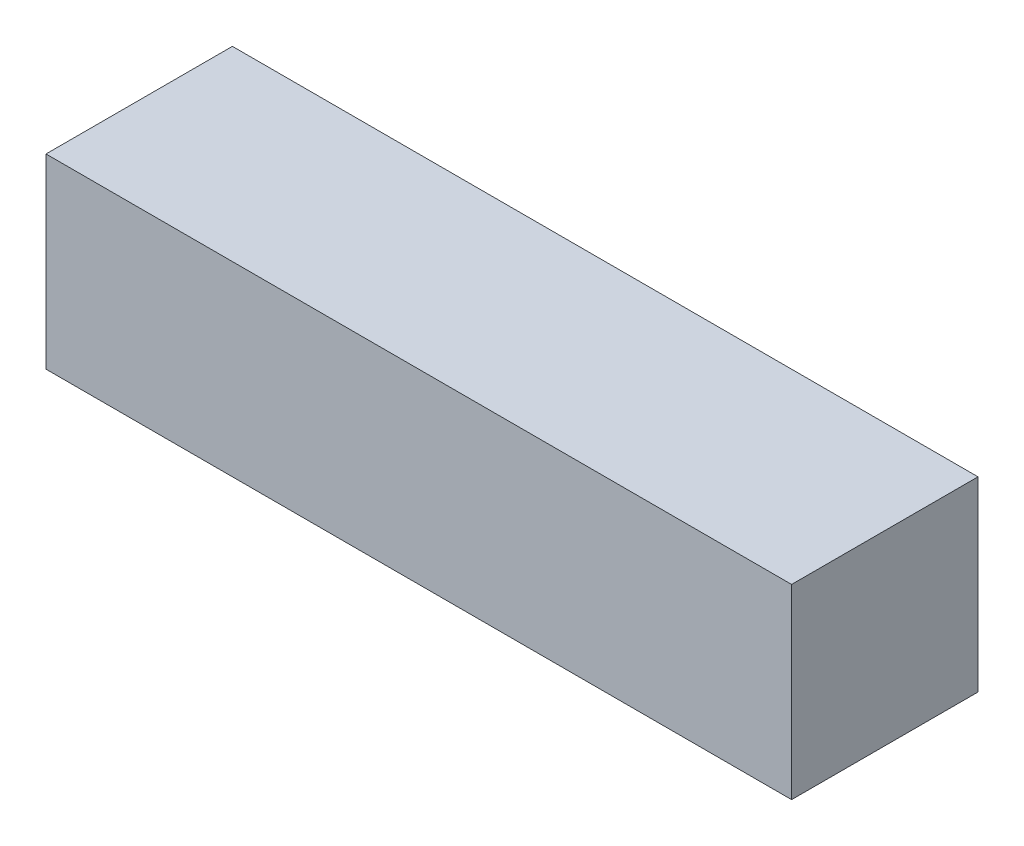
ISO-10303-21;
HEADER;
FILE_DESCRIPTION(('STEP AP214'),'2;1');
FILE_NAME('part.step','',(''),(''),'','','');
FILE_SCHEMA(('AUTOMOTIVE_DESIGN { 1 0 10303 214 1 1 1 1 }'));
ENDSEC;
DATA;
#1=APPLICATION_CONTEXT('core data for automotive mechanical design processes');
#2=APPLICATION_PROTOCOL_DEFINITION('international standard','automotive_design',2000,#1);
#3=PRODUCT_CONTEXT('',#1,'mechanical');
#4=PRODUCT('Part','Part','',(#3));
#5=PRODUCT_RELATED_PRODUCT_CATEGORY('part','',(#4));
#6=PRODUCT_DEFINITION_FORMATION('','',#4);
#7=PRODUCT_DEFINITION_CONTEXT('part definition',#1,'design');
#8=PRODUCT_DEFINITION('design','',#6,#7);
#9=PRODUCT_DEFINITION_SHAPE('','',#8);
#10=(LENGTH_UNIT() NAMED_UNIT(*) SI_UNIT(.MILLI.,.METRE.));
#11=(NAMED_UNIT(*) PLANE_ANGLE_UNIT() SI_UNIT($,.RADIAN.));
#12=(NAMED_UNIT(*) SI_UNIT($,.STERADIAN.) SOLID_ANGLE_UNIT());
#13=UNCERTAINTY_MEASURE_WITH_UNIT(LENGTH_MEASURE(1.E-05),#10,'distance_accuracy_value','');
#14=(GEOMETRIC_REPRESENTATION_CONTEXT(3) GLOBAL_UNCERTAINTY_ASSIGNED_CONTEXT((#13)) GLOBAL_UNIT_ASSIGNED_CONTEXT((#10,
#11,#12)) REPRESENTATION_CONTEXT('',''));
#15=CARTESIAN_POINT('',(0.,0.,0.));
#16=DIRECTION('',(0.,0.,1.));
#17=DIRECTION('',(1.,0.,0.));
#18=AXIS2_PLACEMENT_3D('',#15,#16,#17);
#19=CARTESIAN_POINT('',(-80.,40.,20.));
#20=DIRECTION('',(1.,0.,0.));
#21=DIRECTION('',(0.,0.,-1.));
#22=AXIS2_PLACEMENT_3D('',#19,#20,#21);
#23=PLANE('',#22);
#24=DIRECTION('',(0.,0.,1.));
#25=VECTOR('',#24,1.);
#26=CARTESIAN_POINT('',(-80.,0.,20.));
#27=LINE('',#26,#25);
#28=CARTESIAN_POINT('',(-80.,0.,-20.));
#29=VERTEX_POINT('',#28);
#30=CARTESIAN_POINT('',(-80.,0.,20.));
#31=VERTEX_POINT('',#30);
#32=EDGE_CURVE('E96',#29,#31,#27,.T.);
#33=ORIENTED_EDGE('',*,*,#32,.T.);
#34=DIRECTION('',(0.,-1.,0.));
#35=VECTOR('',#34,1.);
#36=CARTESIAN_POINT('',(-80.,40.,20.));
#37=LINE('',#36,#35);
#38=CARTESIAN_POINT('',(-80.,40.,20.));
#39=VERTEX_POINT('',#38);
#40=EDGE_CURVE('E11',#39,#31,#37,.T.);
#41=ORIENTED_EDGE('',*,*,#40,.F.);
#42=DIRECTION('',(0.,0.,1.));
#43=VECTOR('',#42,1.);
#44=CARTESIAN_POINT('',(-80.,40.,20.));
#45=LINE('',#44,#43);
#46=CARTESIAN_POINT('',(-80.,40.,-20.));
#47=VERTEX_POINT('',#46);
#48=EDGE_CURVE('E84',#47,#39,#45,.T.);
#49=ORIENTED_EDGE('',*,*,#48,.F.);
#50=DIRECTION('',(0.,-1.,0.));
#51=VECTOR('',#50,1.);
#52=CARTESIAN_POINT('',(-80.,40.,-20.));
#53=LINE('',#52,#51);
#54=EDGE_CURVE('E92',#47,#29,#53,.T.);
#55=ORIENTED_EDGE('',*,*,#54,.T.);
#56=EDGE_LOOP('',(#33,#41,#49,#55));
#57=FACE_BOUND('',#56,.T.);
#58=ADVANCED_FACE('F33',(#57),#23,.F.);
#59=CARTESIAN_POINT('',(80.,40.,20.));
#60=DIRECTION('',(0.,0.,-1.));
#61=DIRECTION('',(-1.,0.,0.));
#62=AXIS2_PLACEMENT_3D('',#59,#60,#61);
#63=PLANE('',#62);
#64=DIRECTION('',(1.,0.,0.));
#65=VECTOR('',#64,1.);
#66=CARTESIAN_POINT('',(80.,0.,20.));
#67=LINE('',#66,#65);
#68=CARTESIAN_POINT('',(80.,0.,20.));
#69=VERTEX_POINT('',#68);
#70=EDGE_CURVE('E88',#31,#69,#67,.T.);
#71=ORIENTED_EDGE('',*,*,#70,.T.);
#72=DIRECTION('',(0.,-1.,0.));
#73=VECTOR('',#72,1.);
#74=CARTESIAN_POINT('',(80.,40.,20.));
#75=LINE('',#74,#73);
#76=CARTESIAN_POINT('',(80.,40.,20.));
#77=VERTEX_POINT('',#76);
#78=EDGE_CURVE('E41',#77,#69,#75,.T.);
#79=ORIENTED_EDGE('',*,*,#78,.F.);
#80=DIRECTION('',(1.,0.,0.));
#81=VECTOR('',#80,1.);
#82=CARTESIAN_POINT('',(80.,40.,20.));
#83=LINE('',#82,#81);
#84=EDGE_CURVE('E79',#39,#77,#83,.T.);
#85=ORIENTED_EDGE('',*,*,#84,.F.);
#86=ORIENTED_EDGE('',*,*,#40,.T.);
#87=EDGE_LOOP('',(#71,#79,#85,#86));
#88=FACE_BOUND('',#87,.T.);
#89=ADVANCED_FACE('F87',(#88),#63,.F.);
#90=CARTESIAN_POINT('',(80.,40.,20.));
#91=DIRECTION('',(-1.,0.,0.));
#92=DIRECTION('',(0.,0.,1.));
#93=AXIS2_PLACEMENT_3D('',#90,#91,#92);
#94=PLANE('',#93);
#95=DIRECTION('',(0.,0.,-1.));
#96=VECTOR('',#95,1.);
#97=CARTESIAN_POINT('',(80.,0.,20.));
#98=LINE('',#97,#96);
#99=CARTESIAN_POINT('',(80.,0.,-20.));
#100=VERTEX_POINT('',#99);
#101=EDGE_CURVE('E66',#69,#100,#98,.T.);
#102=ORIENTED_EDGE('',*,*,#101,.T.);
#103=DIRECTION('',(0.,-1.,0.));
#104=VECTOR('',#103,1.);
#105=CARTESIAN_POINT('',(80.,40.,-20.));
#106=LINE('',#105,#104);
#107=CARTESIAN_POINT('',(80.,40.,-20.));
#108=VERTEX_POINT('',#107);
#109=EDGE_CURVE('E89',#108,#100,#106,.T.);
#110=ORIENTED_EDGE('',*,*,#109,.F.);
#111=DIRECTION('',(0.,0.,-1.));
#112=VECTOR('',#111,1.);
#113=CARTESIAN_POINT('',(80.,40.,20.));
#114=LINE('',#113,#112);
#115=EDGE_CURVE('E82',#77,#108,#114,.T.);
#116=ORIENTED_EDGE('',*,*,#115,.F.);
#117=ORIENTED_EDGE('',*,*,#78,.T.);
#118=EDGE_LOOP('',(#102,#110,#116,#117));
#119=FACE_BOUND('',#118,.T.);
#120=ADVANCED_FACE('F90',(#119),#94,.F.);
#121=CARTESIAN_POINT('',(80.,40.,-20.));
#122=DIRECTION('',(0.,0.,1.));
#123=DIRECTION('',(1.,0.,0.));
#124=AXIS2_PLACEMENT_3D('',#121,#122,#123);
#125=PLANE('',#124);
#126=DIRECTION('',(-1.,0.,0.));
#127=VECTOR('',#126,1.);
#128=CARTESIAN_POINT('',(80.,0.,-20.));
#129=LINE('',#128,#127);
#130=EDGE_CURVE('E72',#100,#29,#129,.T.);
#131=ORIENTED_EDGE('',*,*,#130,.T.);
#132=ORIENTED_EDGE('',*,*,#54,.F.);
#133=DIRECTION('',(-1.,0.,0.));
#134=VECTOR('',#133,1.);
#135=CARTESIAN_POINT('',(80.,40.,-20.));
#136=LINE('',#135,#134);
#137=EDGE_CURVE('E49',#108,#47,#136,.T.);
#138=ORIENTED_EDGE('',*,*,#137,.F.);
#139=ORIENTED_EDGE('',*,*,#109,.T.);
#140=EDGE_LOOP('',(#131,#132,#138,#139));
#141=FACE_BOUND('',#140,.T.);
#142=ADVANCED_FACE('F103',(#141),#125,.F.);
#143=CARTESIAN_POINT('',(0.,40.,0.));
#144=DIRECTION('',(0.,1.,0.));
#145=DIRECTION('',(0.,0.,1.));
#146=AXIS2_PLACEMENT_3D('',#143,#144,#145);
#147=PLANE('',#146);
#148=ORIENTED_EDGE('',*,*,#48,.T.);
#149=ORIENTED_EDGE('',*,*,#84,.T.);
#150=ORIENTED_EDGE('',*,*,#115,.T.);
#151=ORIENTED_EDGE('',*,*,#137,.T.);
#152=EDGE_LOOP('',(#148,#149,#150,#151));
#153=FACE_BOUND('',#152,.T.);
#154=ADVANCED_FACE('F80',(#153),#147,.T.);
#155=CARTESIAN_POINT('',(0.,0.,0.));
#156=DIRECTION('',(0.,1.,0.));
#157=DIRECTION('',(0.,0.,1.));
#158=AXIS2_PLACEMENT_3D('',#155,#156,#157);
#159=PLANE('',#158);
#160=ORIENTED_EDGE('',*,*,#32,.F.);
#161=ORIENTED_EDGE('',*,*,#130,.F.);
#162=ORIENTED_EDGE('',*,*,#101,.F.);
#163=ORIENTED_EDGE('',*,*,#70,.F.);
#164=EDGE_LOOP('',(#160,#161,#162,#163));
#165=FACE_BOUND('',#164,.T.);
#166=ADVANCED_FACE('F106',(#165),#159,.F.);
#167=CLOSED_SHELL('',(#58,#89,#120,#142,#154,#166));
#168=MANIFOLD_SOLID_BREP('B2',#167);
#169=ADVANCED_BREP_SHAPE_REPRESENTATION('',(#18,#168),#14);
#170=SHAPE_DEFINITION_REPRESENTATION(#9,#169);
ENDSEC;
END-ISO-10303-21;
